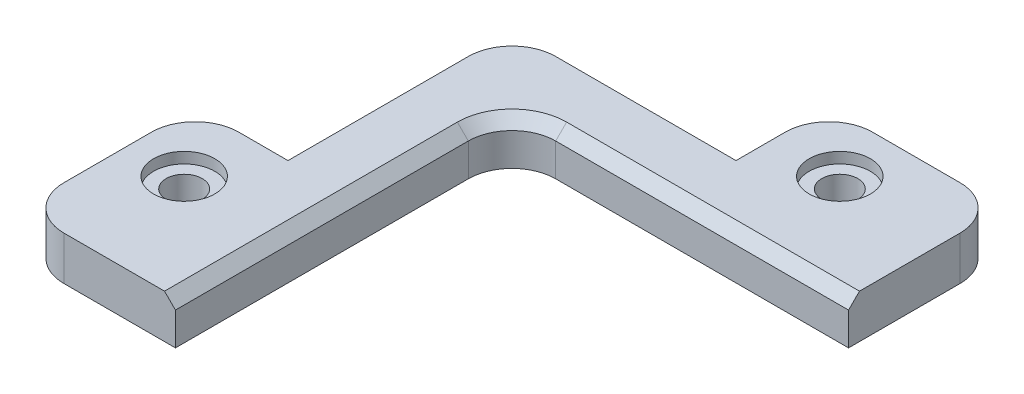
ISO-10303-21;
HEADER;
FILE_DESCRIPTION(('STEP AP214'),'2;1');
FILE_NAME('part.step','',(''),(''),'','','');
FILE_SCHEMA(('AUTOMOTIVE_DESIGN { 1 0 10303 214 1 1 1 1 }'));
ENDSEC;
DATA;
#1=APPLICATION_CONTEXT('core data for automotive mechanical design processes');
#2=APPLICATION_PROTOCOL_DEFINITION('international standard','automotive_design',2000,#1);
#3=PRODUCT_CONTEXT('',#1,'mechanical');
#4=PRODUCT('Part','Part','',(#3));
#5=PRODUCT_RELATED_PRODUCT_CATEGORY('part','',(#4));
#6=PRODUCT_DEFINITION_FORMATION('','',#4);
#7=PRODUCT_DEFINITION_CONTEXT('part definition',#1,'design');
#8=PRODUCT_DEFINITION('design','',#6,#7);
#9=PRODUCT_DEFINITION_SHAPE('','',#8);
#10=(LENGTH_UNIT() NAMED_UNIT(*) SI_UNIT(.MILLI.,.METRE.));
#11=(NAMED_UNIT(*) PLANE_ANGLE_UNIT() SI_UNIT($,.RADIAN.));
#12=(NAMED_UNIT(*) SI_UNIT($,.STERADIAN.) SOLID_ANGLE_UNIT());
#13=UNCERTAINTY_MEASURE_WITH_UNIT(LENGTH_MEASURE(1.E-05),#10,'distance_accuracy_value','');
#14=(GEOMETRIC_REPRESENTATION_CONTEXT(3) GLOBAL_UNCERTAINTY_ASSIGNED_CONTEXT((#13)) GLOBAL_UNIT_ASSIGNED_CONTEXT((#10,
#11,#12)) REPRESENTATION_CONTEXT('',''));
#15=CARTESIAN_POINT('',(0.,0.,0.));
#16=DIRECTION('',(0.,0.,1.));
#17=DIRECTION('',(1.,0.,0.));
#18=AXIS2_PLACEMENT_3D('',#15,#16,#17);
#19=CARTESIAN_POINT('',(35.,4.,-40.));
#20=DIRECTION('',(0.,-1.,0.));
#21=DIRECTION('',(0.,0.,-1.));
#22=AXIS2_PLACEMENT_3D('',#19,#20,#21);
#23=CYLINDRICAL_SURFACE('',#22,1.65);
#24=CARTESIAN_POINT('',(35.,0.,-40.));
#25=DIRECTION('',(0.,1.,0.));
#26=DIRECTION('',(0.,0.,1.));
#27=AXIS2_PLACEMENT_3D('',#24,#25,#26);
#28=CIRCLE('',#27,1.65);
#29=CARTESIAN_POINT('',(35.,0.,-38.35));
#30=VERTEX_POINT('',#29);
#31=EDGE_CURVE('E211',#30,#30,#28,.T.);
#32=ORIENTED_EDGE('',*,*,#31,.F.);
#33=EDGE_LOOP('',(#32));
#34=FACE_BOUND('',#33,.T.);
#35=CARTESIAN_POINT('',(35.,3.,-40.));
#36=DIRECTION('',(0.,1.,0.));
#37=DIRECTION('',(0.,0.,1.));
#38=AXIS2_PLACEMENT_3D('',#35,#36,#37);
#39=CIRCLE('',#38,1.65);
#40=CARTESIAN_POINT('',(35.,3.,-38.35));
#41=VERTEX_POINT('',#40);
#42=EDGE_CURVE('E39',#41,#41,#39,.T.);
#43=ORIENTED_EDGE('',*,*,#42,.T.);
#44=EDGE_LOOP('',(#43));
#45=FACE_BOUND('',#44,.T.);
#46=ADVANCED_FACE('F35',(#34,#45),#23,.F.);
#47=CARTESIAN_POINT('',(5.,4.,-9.99999999999999));
#48=DIRECTION('',(0.,-1.,0.));
#49=DIRECTION('',(0.,0.,-1.));
#50=AXIS2_PLACEMENT_3D('',#47,#48,#49);
#51=CYLINDRICAL_SURFACE('',#50,1.65);
#52=CARTESIAN_POINT('',(5.,0.,-9.99999999999999));
#53=DIRECTION('',(0.,1.,0.));
#54=DIRECTION('',(0.,0.,1.));
#55=AXIS2_PLACEMENT_3D('',#52,#53,#54);
#56=CIRCLE('',#55,1.65);
#57=CARTESIAN_POINT('',(5.,0.,-8.34999999999999));
#58=VERTEX_POINT('',#57);
#59=EDGE_CURVE('E205',#58,#58,#56,.T.);
#60=ORIENTED_EDGE('',*,*,#59,.F.);
#61=EDGE_LOOP('',(#60));
#62=FACE_BOUND('',#61,.T.);
#63=CARTESIAN_POINT('',(5.,3.,-9.99999999999999));
#64=DIRECTION('',(0.,1.,0.));
#65=DIRECTION('',(0.,0.,1.));
#66=AXIS2_PLACEMENT_3D('',#63,#64,#65);
#67=CIRCLE('',#66,1.65);
#68=CARTESIAN_POINT('',(5.,3.,-8.34999999999999));
#69=VERTEX_POINT('',#68);
#70=EDGE_CURVE('E302',#69,#69,#67,.T.);
#71=ORIENTED_EDGE('',*,*,#70,.T.);
#72=EDGE_LOOP('',(#71));
#73=FACE_BOUND('',#72,.T.);
#74=ADVANCED_FACE('F406',(#62,#73),#51,.F.);
#75=CARTESIAN_POINT('',(0.,4.,-45.));
#76=DIRECTION('',(0.,0.,1.));
#77=DIRECTION('',(1.,0.,0.));
#78=AXIS2_PLACEMENT_3D('',#75,#76,#77);
#79=PLANE('',#78);
#80=DIRECTION('',(-1.,0.,0.));
#81=VECTOR('',#80,1.);
#82=CARTESIAN_POINT('',(0.,0.,-45.));
#83=LINE('',#82,#81);
#84=CARTESIAN_POINT('',(41.,0.,-45.));
#85=VERTEX_POINT('',#84);
#86=CARTESIAN_POINT('',(33.,0.,-45.));
#87=VERTEX_POINT('',#86);
#88=EDGE_CURVE('E230',#85,#87,#83,.T.);
#89=ORIENTED_EDGE('',*,*,#88,.T.);
#90=DIRECTION('',(0.,1.,0.));
#91=VECTOR('',#90,1.);
#92=CARTESIAN_POINT('',(33.,4.,-45.));
#93=LINE('',#92,#91);
#94=CARTESIAN_POINT('',(33.,4.,-45.));
#95=VERTEX_POINT('',#94);
#96=EDGE_CURVE('E276',#87,#95,#93,.T.);
#97=ORIENTED_EDGE('',*,*,#96,.T.);
#98=DIRECTION('',(-1.,0.,0.));
#99=VECTOR('',#98,1.);
#100=CARTESIAN_POINT('',(0.,4.,-45.));
#101=LINE('',#100,#99);
#102=CARTESIAN_POINT('',(41.,4.,-45.));
#103=VERTEX_POINT('',#102);
#104=EDGE_CURVE('E220',#103,#95,#101,.T.);
#105=ORIENTED_EDGE('',*,*,#104,.F.);
#106=DIRECTION('',(0.,-1.,0.));
#107=VECTOR('',#106,1.);
#108=CARTESIAN_POINT('',(41.,4.,-45.));
#109=LINE('',#108,#107);
#110=EDGE_CURVE('E273',#103,#85,#109,.T.);
#111=ORIENTED_EDGE('',*,*,#110,.T.);
#112=EDGE_LOOP('',(#89,#97,#105,#111));
#113=FACE_BOUND('',#112,.T.);
#114=ADVANCED_FACE('F352',(#113),#79,.F.);
#115=CARTESIAN_POINT('',(0.,4.,0.));
#116=DIRECTION('',(0.,-1.,0.));
#117=DIRECTION('',(0.,0.,-1.));
#118=AXIS2_PLACEMENT_3D('',#115,#116,#117);
#119=PLANE('',#118);
#120=CARTESIAN_POINT('',(35.,4.,-40.));
#121=DIRECTION('',(0.,1.,0.));
#122=DIRECTION('',(0.,0.,1.));
#123=AXIS2_PLACEMENT_3D('',#120,#121,#122);
#124=CIRCLE('',#123,2.8);
#125=CARTESIAN_POINT('',(35.,4.,-37.2));
#126=VERTEX_POINT('',#125);
#127=EDGE_CURVE('E309',#126,#126,#124,.T.);
#128=ORIENTED_EDGE('',*,*,#127,.F.);
#129=EDGE_LOOP('',(#128));
#130=FACE_BOUND('',#129,.T.);
#131=CARTESIAN_POINT('',(5.,4.,-9.99999999999999));
#132=DIRECTION('',(0.,1.,0.));
#133=DIRECTION('',(0.,0.,1.));
#134=AXIS2_PLACEMENT_3D('',#131,#132,#133);
#135=CIRCLE('',#134,2.8);
#136=CARTESIAN_POINT('',(5.,4.,-7.19999999999999));
#137=VERTEX_POINT('',#136);
#138=EDGE_CURVE('E319',#137,#137,#135,.T.);
#139=ORIENTED_EDGE('',*,*,#138,.F.);
#140=EDGE_LOOP('',(#139));
#141=FACE_BOUND('',#140,.T.);
#142=DIRECTION('',(1.,0.,0.));
#143=VECTOR('',#142,1.);
#144=CARTESIAN_POINT('',(10.,4.,0.));
#145=LINE('',#144,#143);
#146=CARTESIAN_POINT('',(4.,4.,0.));
#147=VERTEX_POINT('',#146);
#148=CARTESIAN_POINT('',(13.2,4.,0.));
#149=VERTEX_POINT('',#148);
#150=EDGE_CURVE('E215',#147,#149,#145,.T.);
#151=ORIENTED_EDGE('',*,*,#150,.T.);
#152=DIRECTION('',(0.,0.,-1.));
#153=VECTOR('',#152,1.);
#154=CARTESIAN_POINT('',(13.2,4.,-26.8));
#155=LINE('',#154,#153);
#156=CARTESIAN_POINT('',(13.2,4.,-26.8));
#157=VERTEX_POINT('',#156);
#158=EDGE_CURVE('E288',#149,#157,#155,.T.);
#159=ORIENTED_EDGE('',*,*,#158,.T.);
#160=CARTESIAN_POINT('',(18.2,4.,-26.8));
#161=DIRECTION('',(0.,-1.,0.));
#162=DIRECTION('',(0.,0.,-1.));
#163=AXIS2_PLACEMENT_3D('',#160,#161,#162);
#164=CIRCLE('',#163,4.99999999999998);
#165=CARTESIAN_POINT('',(18.2,4.,-31.8));
#166=VERTEX_POINT('',#165);
#167=EDGE_CURVE('E286',#157,#166,#164,.T.);
#168=ORIENTED_EDGE('',*,*,#167,.T.);
#169=DIRECTION('',(1.,0.,0.));
#170=VECTOR('',#169,1.);
#171=CARTESIAN_POINT('',(0.,4.,-31.8));
#172=LINE('',#171,#170);
#173=CARTESIAN_POINT('',(45.,4.,-31.8));
#174=VERTEX_POINT('',#173);
#175=EDGE_CURVE('E284',#166,#174,#172,.T.);
#176=ORIENTED_EDGE('',*,*,#175,.T.);
#177=DIRECTION('',(0.,0.,-1.));
#178=VECTOR('',#177,1.);
#179=CARTESIAN_POINT('',(45.,4.,-45.));
#180=LINE('',#179,#178);
#181=CARTESIAN_POINT('',(45.,4.,-41.));
#182=VERTEX_POINT('',#181);
#183=EDGE_CURVE('E217',#174,#182,#180,.T.);
#184=ORIENTED_EDGE('',*,*,#183,.T.);
#185=CARTESIAN_POINT('',(41.,4.,-41.));
#186=DIRECTION('',(0.,-1.,0.));
#187=DIRECTION('',(0.,0.,-1.));
#188=AXIS2_PLACEMENT_3D('',#185,#186,#187);
#189=CIRCLE('',#188,4.);
#190=EDGE_CURVE('E263',#182,#103,#189,.F.);
#191=ORIENTED_EDGE('',*,*,#190,.T.);
#192=ORIENTED_EDGE('',*,*,#104,.T.);
#193=CARTESIAN_POINT('',(33.,4.,-41.));
#194=DIRECTION('',(0.,-1.,0.));
#195=DIRECTION('',(0.,0.,-1.));
#196=AXIS2_PLACEMENT_3D('',#193,#194,#195);
#197=CIRCLE('',#196,4.);
#198=CARTESIAN_POINT('',(29.,4.,-41.));
#199=VERTEX_POINT('',#198);
#200=EDGE_CURVE('E167',#95,#199,#197,.F.);
#201=ORIENTED_EDGE('',*,*,#200,.T.);
#202=DIRECTION('',(0.,0.,1.));
#203=VECTOR('',#202,1.);
#204=CARTESIAN_POINT('',(29.,4.,0.));
#205=LINE('',#204,#203);
#206=CARTESIAN_POINT('',(29.,4.,-36.5));
#207=VERTEX_POINT('',#206);
#208=EDGE_CURVE('E161',#199,#207,#205,.T.);
#209=ORIENTED_EDGE('',*,*,#208,.T.);
#210=DIRECTION('',(1.,0.,0.));
#211=VECTOR('',#210,1.);
#212=CARTESIAN_POINT('',(0.,4.,-36.5));
#213=LINE('',#212,#211);
#214=CARTESIAN_POINT('',(12.5,4.,-36.5));
#215=VERTEX_POINT('',#214);
#216=EDGE_CURVE('E165',#215,#207,#213,.T.);
#217=ORIENTED_EDGE('',*,*,#216,.F.);
#218=CARTESIAN_POINT('',(12.5,4.,-32.5));
#219=DIRECTION('',(0.,-1.,0.));
#220=DIRECTION('',(0.,0.,-1.));
#221=AXIS2_PLACEMENT_3D('',#218,#219,#220);
#222=CIRCLE('',#221,4.);
#223=CARTESIAN_POINT('',(8.5,4.,-32.5));
#224=VERTEX_POINT('',#223);
#225=EDGE_CURVE('E240',#215,#224,#222,.F.);
#226=ORIENTED_EDGE('',*,*,#225,.T.);
#227=DIRECTION('',(0.,0.,1.));
#228=VECTOR('',#227,1.);
#229=CARTESIAN_POINT('',(8.50000000000001,4.,0.));
#230=LINE('',#229,#228);
#231=CARTESIAN_POINT('',(8.5,4.,-16.));
#232=VERTEX_POINT('',#231);
#233=EDGE_CURVE('E190',#224,#232,#230,.T.);
#234=ORIENTED_EDGE('',*,*,#233,.T.);
#235=DIRECTION('',(1.,0.,0.));
#236=VECTOR('',#235,1.);
#237=CARTESIAN_POINT('',(0.,4.,-16.));
#238=LINE('',#237,#236);
#239=CARTESIAN_POINT('',(4.,4.,-16.));
#240=VERTEX_POINT('',#239);
#241=EDGE_CURVE('E182',#240,#232,#238,.T.);
#242=ORIENTED_EDGE('',*,*,#241,.F.);
#243=CARTESIAN_POINT('',(4.,4.,-12.));
#244=DIRECTION('',(0.,-1.,0.));
#245=DIRECTION('',(0.,0.,-1.));
#246=AXIS2_PLACEMENT_3D('',#243,#244,#245);
#247=CIRCLE('',#246,4.);
#248=CARTESIAN_POINT('',(0.,4.,-12.));
#249=VERTEX_POINT('',#248);
#250=EDGE_CURVE('E266',#240,#249,#247,.F.);
#251=ORIENTED_EDGE('',*,*,#250,.T.);
#252=DIRECTION('',(0.,0.,1.));
#253=VECTOR('',#252,1.);
#254=CARTESIAN_POINT('',(0.,4.,0.));
#255=LINE('',#254,#253);
#256=CARTESIAN_POINT('',(0.,4.,-4.));
#257=VERTEX_POINT('',#256);
#258=EDGE_CURVE('E222',#249,#257,#255,.T.);
#259=ORIENTED_EDGE('',*,*,#258,.T.);
#260=CARTESIAN_POINT('',(4.,4.,-4.));
#261=DIRECTION('',(0.,-1.,0.));
#262=DIRECTION('',(0.,0.,-1.));
#263=AXIS2_PLACEMENT_3D('',#260,#261,#262);
#264=CIRCLE('',#263,4.);
#265=EDGE_CURVE('E268',#257,#147,#264,.F.);
#266=ORIENTED_EDGE('',*,*,#265,.T.);
#267=EDGE_LOOP('',(#151,#159,#168,#176,#184,#191,#192,#201,#209,#217,#226,#234,#242,#251,#259,#266));
#268=FACE_BOUND('',#267,.T.);
#269=ADVANCED_FACE('F164',(#130,#141,#268),#119,.F.);
#270=CARTESIAN_POINT('',(0.,0.,0.));
#271=DIRECTION('',(0.,-1.,0.));
#272=DIRECTION('',(0.,0.,-1.));
#273=AXIS2_PLACEMENT_3D('',#270,#271,#272);
#274=PLANE('',#273);
#275=DIRECTION('',(1.,0.,0.));
#276=VECTOR('',#275,1.);
#277=CARTESIAN_POINT('',(10.,0.,0.));
#278=LINE('',#277,#276);
#279=CARTESIAN_POINT('',(4.,0.,0.));
#280=VERTEX_POINT('',#279);
#281=CARTESIAN_POINT('',(14.2,0.,0.));
#282=VERTEX_POINT('',#281);
#283=EDGE_CURVE('E214',#280,#282,#278,.T.);
#284=ORIENTED_EDGE('',*,*,#283,.F.);
#285=CARTESIAN_POINT('',(4.,0.,-4.));
#286=DIRECTION('',(0.,-1.,0.));
#287=DIRECTION('',(0.,0.,-1.));
#288=AXIS2_PLACEMENT_3D('',#285,#286,#287);
#289=CIRCLE('',#288,4.);
#290=CARTESIAN_POINT('',(0.,0.,-4.));
#291=VERTEX_POINT('',#290);
#292=EDGE_CURVE('E257',#280,#291,#289,.T.);
#293=ORIENTED_EDGE('',*,*,#292,.T.);
#294=DIRECTION('',(0.,0.,1.));
#295=VECTOR('',#294,1.);
#296=CARTESIAN_POINT('',(0.,0.,0.));
#297=LINE('',#296,#295);
#298=CARTESIAN_POINT('',(0.,0.,-12.));
#299=VERTEX_POINT('',#298);
#300=EDGE_CURVE('E218',#299,#291,#297,.T.);
#301=ORIENTED_EDGE('',*,*,#300,.F.);
#302=CARTESIAN_POINT('',(4.,0.,-12.));
#303=DIRECTION('',(0.,-1.,0.));
#304=DIRECTION('',(0.,0.,-1.));
#305=AXIS2_PLACEMENT_3D('',#302,#303,#304);
#306=CIRCLE('',#305,4.);
#307=CARTESIAN_POINT('',(4.,0.,-16.));
#308=VERTEX_POINT('',#307);
#309=EDGE_CURVE('E255',#299,#308,#306,.T.);
#310=ORIENTED_EDGE('',*,*,#309,.T.);
#311=DIRECTION('',(1.,0.,0.));
#312=VECTOR('',#311,1.);
#313=CARTESIAN_POINT('',(0.,0.,-16.));
#314=LINE('',#313,#312);
#315=CARTESIAN_POINT('',(8.5,0.,-16.));
#316=VERTEX_POINT('',#315);
#317=EDGE_CURVE('E181',#308,#316,#314,.T.);
#318=ORIENTED_EDGE('',*,*,#317,.T.);
#319=DIRECTION('',(0.,0.,1.));
#320=VECTOR('',#319,1.);
#321=CARTESIAN_POINT('',(8.50000000000001,0.,0.));
#322=LINE('',#321,#320);
#323=CARTESIAN_POINT('',(8.5,0.,-32.5));
#324=VERTEX_POINT('',#323);
#325=EDGE_CURVE('E324',#324,#316,#322,.T.);
#326=ORIENTED_EDGE('',*,*,#325,.F.);
#327=CARTESIAN_POINT('',(12.5,0.,-32.5));
#328=DIRECTION('',(0.,-1.,0.));
#329=DIRECTION('',(0.,0.,-1.));
#330=AXIS2_PLACEMENT_3D('',#327,#328,#329);
#331=CIRCLE('',#330,4.);
#332=CARTESIAN_POINT('',(12.5,0.,-36.5));
#333=VERTEX_POINT('',#332);
#334=EDGE_CURVE('E244',#324,#333,#331,.T.);
#335=ORIENTED_EDGE('',*,*,#334,.T.);
#336=DIRECTION('',(1.,0.,0.));
#337=VECTOR('',#336,1.);
#338=CARTESIAN_POINT('',(0.,0.,-36.5));
#339=LINE('',#338,#337);
#340=CARTESIAN_POINT('',(29.,0.,-36.5));
#341=VERTEX_POINT('',#340);
#342=EDGE_CURVE('E188',#333,#341,#339,.T.);
#343=ORIENTED_EDGE('',*,*,#342,.T.);
#344=DIRECTION('',(0.,0.,1.));
#345=VECTOR('',#344,1.);
#346=CARTESIAN_POINT('',(29.,0.,0.));
#347=LINE('',#346,#345);
#348=CARTESIAN_POINT('',(29.,0.,-41.));
#349=VERTEX_POINT('',#348);
#350=EDGE_CURVE('E186',#349,#341,#347,.T.);
#351=ORIENTED_EDGE('',*,*,#350,.F.);
#352=CARTESIAN_POINT('',(33.,0.,-41.));
#353=DIRECTION('',(0.,-1.,0.));
#354=DIRECTION('',(0.,0.,-1.));
#355=AXIS2_PLACEMENT_3D('',#352,#353,#354);
#356=CIRCLE('',#355,4.);
#357=EDGE_CURVE('E253',#349,#87,#356,.T.);
#358=ORIENTED_EDGE('',*,*,#357,.T.);
#359=ORIENTED_EDGE('',*,*,#88,.F.);
#360=CARTESIAN_POINT('',(41.,0.,-41.));
#361=DIRECTION('',(0.,-1.,0.));
#362=DIRECTION('',(0.,0.,-1.));
#363=AXIS2_PLACEMENT_3D('',#360,#361,#362);
#364=CIRCLE('',#363,4.);
#365=CARTESIAN_POINT('',(45.,0.,-41.));
#366=VERTEX_POINT('',#365);
#367=EDGE_CURVE('E251',#85,#366,#364,.T.);
#368=ORIENTED_EDGE('',*,*,#367,.T.);
#369=DIRECTION('',(0.,0.,-1.));
#370=VECTOR('',#369,1.);
#371=CARTESIAN_POINT('',(45.,0.,-45.));
#372=LINE('',#371,#370);
#373=CARTESIAN_POINT('',(45.,0.,-30.8));
#374=VERTEX_POINT('',#373);
#375=EDGE_CURVE('E227',#374,#366,#372,.T.);
#376=ORIENTED_EDGE('',*,*,#375,.F.);
#377=DIRECTION('',(-1.,0.,0.));
#378=VECTOR('',#377,1.);
#379=CARTESIAN_POINT('',(0.,0.,-30.8));
#380=LINE('',#379,#378);
#381=CARTESIAN_POINT('',(18.2,0.,-30.8));
#382=VERTEX_POINT('',#381);
#383=EDGE_CURVE('E202',#374,#382,#380,.T.);
#384=ORIENTED_EDGE('',*,*,#383,.T.);
#385=CARTESIAN_POINT('',(18.2,0.,-26.8));
#386=DIRECTION('',(0.,-1.,0.));
#387=DIRECTION('',(0.,0.,-1.));
#388=AXIS2_PLACEMENT_3D('',#385,#386,#387);
#389=CIRCLE('',#388,4.);
#390=CARTESIAN_POINT('',(14.2,0.,-26.8));
#391=VERTEX_POINT('',#390);
#392=EDGE_CURVE('E246',#382,#391,#389,.F.);
#393=ORIENTED_EDGE('',*,*,#392,.T.);
#394=DIRECTION('',(0.,0.,-1.));
#395=VECTOR('',#394,1.);
#396=CARTESIAN_POINT('',(14.2,0.,0.));
#397=LINE('',#396,#395);
#398=EDGE_CURVE('E198',#282,#391,#397,.T.);
#399=ORIENTED_EDGE('',*,*,#398,.F.);
#400=EDGE_LOOP('',(#284,#293,#301,#310,#318,#326,#335,#343,#351,#358,#359,#368,#376,#384,#393,#399));
#401=FACE_BOUND('',#400,.T.);
#402=ORIENTED_EDGE('',*,*,#31,.T.);
#403=EDGE_LOOP('',(#402));
#404=FACE_BOUND('',#403,.T.);
#405=ORIENTED_EDGE('',*,*,#59,.T.);
#406=EDGE_LOOP('',(#405));
#407=FACE_BOUND('',#406,.T.);
#408=ADVANCED_FACE('F343',(#401,#404,#407),#274,.T.);
#409=CARTESIAN_POINT('',(10.,4.,0.));
#410=DIRECTION('',(0.,0.,-1.));
#411=DIRECTION('',(-1.,0.,0.));
#412=AXIS2_PLACEMENT_3D('',#409,#410,#411);
#413=PLANE('',#412);
#414=DIRECTION('',(0.,1.,0.));
#415=VECTOR('',#414,1.);
#416=CARTESIAN_POINT('',(14.2,-49.4974746830583,0.));
#417=LINE('',#416,#415);
#418=CARTESIAN_POINT('',(14.2,3.00000000000002,0.));
#419=VERTEX_POINT('',#418);
#420=EDGE_CURVE('E201',#282,#419,#417,.T.);
#421=ORIENTED_EDGE('',*,*,#420,.T.);
#422=DIRECTION('',(-0.707106781186549,0.707106781186546,0.));
#423=VECTOR('',#422,1.);
#424=CARTESIAN_POINT('',(13.2,4.,0.));
#425=LINE('',#424,#423);
#426=EDGE_CURVE('E293',#419,#149,#425,.T.);
#427=ORIENTED_EDGE('',*,*,#426,.T.);
#428=ORIENTED_EDGE('',*,*,#150,.F.);
#429=DIRECTION('',(0.,-1.,0.));
#430=VECTOR('',#429,1.);
#431=CARTESIAN_POINT('',(4.,4.,0.));
#432=LINE('',#431,#430);
#433=EDGE_CURVE('E248',#147,#280,#432,.T.);
#434=ORIENTED_EDGE('',*,*,#433,.T.);
#435=ORIENTED_EDGE('',*,*,#283,.T.);
#436=EDGE_LOOP('',(#421,#427,#428,#434,#435));
#437=FACE_BOUND('',#436,.T.);
#438=ADVANCED_FACE('F385',(#437),#413,.F.);
#439=CARTESIAN_POINT('',(45.,4.,-45.));
#440=DIRECTION('',(-1.,0.,0.));
#441=DIRECTION('',(0.,0.,1.));
#442=AXIS2_PLACEMENT_3D('',#439,#440,#441);
#443=PLANE('',#442);
#444=ORIENTED_EDGE('',*,*,#183,.F.);
#445=DIRECTION('',(0.,0.707106781186545,-0.70710678118655));
#446=VECTOR('',#445,1.);
#447=CARTESIAN_POINT('',(45.,3.00000000000001,-30.8));
#448=LINE('',#447,#446);
#449=CARTESIAN_POINT('',(45.,3.00000000000002,-30.8));
#450=VERTEX_POINT('',#449);
#451=EDGE_CURVE('E11',#174,#450,#448,.F.);
#452=ORIENTED_EDGE('',*,*,#451,.T.);
#453=DIRECTION('',(0.,1.,0.));
#454=VECTOR('',#453,1.);
#455=CARTESIAN_POINT('',(45.,-49.4974746830583,-30.8));
#456=LINE('',#455,#454);
#457=EDGE_CURVE('E171',#374,#450,#456,.T.);
#458=ORIENTED_EDGE('',*,*,#457,.F.);
#459=ORIENTED_EDGE('',*,*,#375,.T.);
#460=DIRECTION('',(0.,-1.,0.));
#461=VECTOR('',#460,1.);
#462=CARTESIAN_POINT('',(45.,4.,-41.));
#463=LINE('',#462,#461);
#464=EDGE_CURVE('E281',#366,#182,#463,.F.);
#465=ORIENTED_EDGE('',*,*,#464,.T.);
#466=EDGE_LOOP('',(#444,#452,#458,#459,#465));
#467=FACE_BOUND('',#466,.T.);
#468=ADVANCED_FACE('F358',(#467),#443,.F.);
#469=CARTESIAN_POINT('',(0.,4.,0.));
#470=DIRECTION('',(1.,0.,0.));
#471=DIRECTION('',(0.,0.,-1.));
#472=AXIS2_PLACEMENT_3D('',#469,#470,#471);
#473=PLANE('',#472);
#474=ORIENTED_EDGE('',*,*,#300,.T.);
#475=DIRECTION('',(0.,-1.,0.));
#476=VECTOR('',#475,1.);
#477=CARTESIAN_POINT('',(0.,4.,-4.));
#478=LINE('',#477,#476);
#479=EDGE_CURVE('E261',#291,#257,#478,.F.);
#480=ORIENTED_EDGE('',*,*,#479,.T.);
#481=ORIENTED_EDGE('',*,*,#258,.F.);
#482=DIRECTION('',(0.,1.,0.));
#483=VECTOR('',#482,1.);
#484=CARTESIAN_POINT('',(0.,4.,-12.));
#485=LINE('',#484,#483);
#486=EDGE_CURVE('E259',#249,#299,#485,.F.);
#487=ORIENTED_EDGE('',*,*,#486,.T.);
#488=EDGE_LOOP('',(#474,#480,#481,#487));
#489=FACE_BOUND('',#488,.T.);
#490=ADVANCED_FACE('F392',(#489),#473,.F.);
#491=CARTESIAN_POINT('',(0.,-49.4974746830583,-30.8));
#492=DIRECTION('',(0.,0.,-1.));
#493=DIRECTION('',(-1.,0.,0.));
#494=AXIS2_PLACEMENT_3D('',#491,#492,#493);
#495=PLANE('',#494);
#496=ORIENTED_EDGE('',*,*,#457,.T.);
#497=DIRECTION('',(-1.,0.,0.));
#498=VECTOR('',#497,1.);
#499=CARTESIAN_POINT('',(0.,3.00000000000002,-30.8));
#500=LINE('',#499,#498);
#501=CARTESIAN_POINT('',(18.2,3.00000000000002,-30.8));
#502=VERTEX_POINT('',#501);
#503=EDGE_CURVE('E44',#450,#502,#500,.T.);
#504=ORIENTED_EDGE('',*,*,#503,.T.);
#505=DIRECTION('',(0.,1.,0.));
#506=VECTOR('',#505,1.);
#507=CARTESIAN_POINT('',(18.2,-49.4974746830583,-30.8));
#508=LINE('',#507,#506);
#509=EDGE_CURVE('E237',#502,#382,#508,.F.);
#510=ORIENTED_EDGE('',*,*,#509,.T.);
#511=ORIENTED_EDGE('',*,*,#383,.F.);
#512=EDGE_LOOP('',(#496,#504,#510,#511));
#513=FACE_BOUND('',#512,.T.);
#514=ADVANCED_FACE('F360',(#513),#495,.F.);
#515=CARTESIAN_POINT('',(14.2,-49.4974746830583,0.));
#516=DIRECTION('',(1.,0.,0.));
#517=DIRECTION('',(0.,0.,-1.));
#518=AXIS2_PLACEMENT_3D('',#515,#516,#517);
#519=PLANE('',#518);
#520=DIRECTION('',(0.,1.,0.));
#521=VECTOR('',#520,1.);
#522=CARTESIAN_POINT('',(14.2,-49.4974746830583,-26.8));
#523=LINE('',#522,#521);
#524=CARTESIAN_POINT('',(14.2,3.00000000000002,-26.8));
#525=VERTEX_POINT('',#524);
#526=EDGE_CURVE('E225',#391,#525,#523,.T.);
#527=ORIENTED_EDGE('',*,*,#526,.T.);
#528=DIRECTION('',(0.,0.,1.));
#529=VECTOR('',#528,1.);
#530=CARTESIAN_POINT('',(14.2,3.00000000000002,0.));
#531=LINE('',#530,#529);
#532=EDGE_CURVE('E291',#525,#419,#531,.T.);
#533=ORIENTED_EDGE('',*,*,#532,.T.);
#534=ORIENTED_EDGE('',*,*,#420,.F.);
#535=ORIENTED_EDGE('',*,*,#398,.T.);
#536=EDGE_LOOP('',(#527,#533,#534,#535));
#537=FACE_BOUND('',#536,.T.);
#538=ADVANCED_FACE('F370',(#537),#519,.T.);
#539=CARTESIAN_POINT('',(0.,-41.0121933088198,-16.));
#540=DIRECTION('',(0.,0.,1.));
#541=DIRECTION('',(1.,0.,0.));
#542=AXIS2_PLACEMENT_3D('',#539,#540,#541);
#543=PLANE('',#542);
#544=ORIENTED_EDGE('',*,*,#317,.F.);
#545=DIRECTION('',(0.,1.,0.));
#546=VECTOR('',#545,1.);
#547=CARTESIAN_POINT('',(4.,-41.0121933088198,-16.));
#548=LINE('',#547,#546);
#549=EDGE_CURVE('E270',#308,#240,#548,.T.);
#550=ORIENTED_EDGE('',*,*,#549,.T.);
#551=ORIENTED_EDGE('',*,*,#241,.T.);
#552=DIRECTION('',(0.,1.,0.));
#553=VECTOR('',#552,1.);
#554=CARTESIAN_POINT('',(8.5,-41.0121933088198,-16.));
#555=LINE('',#554,#553);
#556=EDGE_CURVE('E195',#316,#232,#555,.T.);
#557=ORIENTED_EDGE('',*,*,#556,.F.);
#558=EDGE_LOOP('',(#544,#550,#551,#557));
#559=FACE_BOUND('',#558,.T.);
#560=ADVANCED_FACE('F337',(#559),#543,.F.);
#561=CARTESIAN_POINT('',(8.50000000000001,-41.0121933088198,0.));
#562=DIRECTION('',(-1.,0.,0.));
#563=DIRECTION('',(0.,0.,1.));
#564=AXIS2_PLACEMENT_3D('',#561,#562,#563);
#565=PLANE('',#564);
#566=ORIENTED_EDGE('',*,*,#233,.F.);
#567=DIRECTION('',(0.,1.,0.));
#568=VECTOR('',#567,1.);
#569=CARTESIAN_POINT('',(8.5,0.,-32.5));
#570=LINE('',#569,#568);
#571=EDGE_CURVE('E242',#224,#324,#570,.F.);
#572=ORIENTED_EDGE('',*,*,#571,.T.);
#573=ORIENTED_EDGE('',*,*,#325,.T.);
#574=ORIENTED_EDGE('',*,*,#556,.T.);
#575=EDGE_LOOP('',(#566,#572,#573,#574));
#576=FACE_BOUND('',#575,.T.);
#577=ADVANCED_FACE('F331',(#576),#565,.T.);
#578=CARTESIAN_POINT('',(0.,-41.0121933088198,-36.5));
#579=DIRECTION('',(0.,0.,1.));
#580=DIRECTION('',(1.,0.,0.));
#581=AXIS2_PLACEMENT_3D('',#578,#579,#580);
#582=PLANE('',#581);
#583=ORIENTED_EDGE('',*,*,#342,.F.);
#584=DIRECTION('',(0.,1.,0.));
#585=VECTOR('',#584,1.);
#586=CARTESIAN_POINT('',(12.5,4.,-36.5));
#587=LINE('',#586,#585);
#588=EDGE_CURVE('E180',#333,#215,#587,.T.);
#589=ORIENTED_EDGE('',*,*,#588,.T.);
#590=ORIENTED_EDGE('',*,*,#216,.T.);
#591=DIRECTION('',(0.,1.,0.));
#592=VECTOR('',#591,1.);
#593=CARTESIAN_POINT('',(29.,-41.0121933088198,-36.5));
#594=LINE('',#593,#592);
#595=EDGE_CURVE('E172',#341,#207,#594,.T.);
#596=ORIENTED_EDGE('',*,*,#595,.F.);
#597=EDGE_LOOP('',(#583,#589,#590,#596));
#598=FACE_BOUND('',#597,.T.);
#599=ADVANCED_FACE('F178',(#598),#582,.F.);
#600=CARTESIAN_POINT('',(29.,-41.0121933088198,0.));
#601=DIRECTION('',(-1.,0.,0.));
#602=DIRECTION('',(0.,0.,1.));
#603=AXIS2_PLACEMENT_3D('',#600,#601,#602);
#604=PLANE('',#603);
#605=ORIENTED_EDGE('',*,*,#208,.F.);
#606=DIRECTION('',(0.,1.,0.));
#607=VECTOR('',#606,1.);
#608=CARTESIAN_POINT('',(29.,0.,-41.));
#609=LINE('',#608,#607);
#610=EDGE_CURVE('E279',#199,#349,#609,.F.);
#611=ORIENTED_EDGE('',*,*,#610,.T.);
#612=ORIENTED_EDGE('',*,*,#350,.T.);
#613=ORIENTED_EDGE('',*,*,#595,.T.);
#614=EDGE_LOOP('',(#605,#611,#612,#613));
#615=FACE_BOUND('',#614,.T.);
#616=ADVANCED_FACE('F184',(#615),#604,.T.);
#617=CARTESIAN_POINT('',(18.2,-49.4974746830583,-26.8));
#618=DIRECTION('',(0.,1.,0.));
#619=DIRECTION('',(0.,0.,1.));
#620=AXIS2_PLACEMENT_3D('',#617,#618,#619);
#621=CYLINDRICAL_SURFACE('',#620,4.);
#622=ORIENTED_EDGE('',*,*,#509,.F.);
#623=CARTESIAN_POINT('',(18.2,3.00000000000002,-26.8));
#624=DIRECTION('',(0.,-1.,0.));
#625=DIRECTION('',(0.,0.,-1.));
#626=AXIS2_PLACEMENT_3D('',#623,#624,#625);
#627=CIRCLE('',#626,4.);
#628=EDGE_CURVE('E295',#502,#525,#627,.F.);
#629=ORIENTED_EDGE('',*,*,#628,.T.);
#630=ORIENTED_EDGE('',*,*,#526,.F.);
#631=ORIENTED_EDGE('',*,*,#392,.F.);
#632=EDGE_LOOP('',(#622,#629,#630,#631));
#633=FACE_BOUND('',#632,.T.);
#634=ADVANCED_FACE('F365',(#633),#621,.F.);
#635=CARTESIAN_POINT('',(12.5,-41.0121933088198,-32.5));
#636=DIRECTION('',(0.,-1.,0.));
#637=DIRECTION('',(0.,0.,-1.));
#638=AXIS2_PLACEMENT_3D('',#635,#636,#637);
#639=CYLINDRICAL_SURFACE('',#638,4.);
#640=ORIENTED_EDGE('',*,*,#334,.F.);
#641=ORIENTED_EDGE('',*,*,#571,.F.);
#642=ORIENTED_EDGE('',*,*,#225,.F.);
#643=ORIENTED_EDGE('',*,*,#588,.F.);
#644=EDGE_LOOP('',(#640,#641,#642,#643));
#645=FACE_BOUND('',#644,.T.);
#646=ADVANCED_FACE('F341',(#645),#639,.T.);
#647=CARTESIAN_POINT('',(4.,4.,-4.));
#648=DIRECTION('',(0.,-1.,0.));
#649=DIRECTION('',(0.,0.,-1.));
#650=AXIS2_PLACEMENT_3D('',#647,#648,#649);
#651=CYLINDRICAL_SURFACE('',#650,4.);
#652=ORIENTED_EDGE('',*,*,#265,.F.);
#653=ORIENTED_EDGE('',*,*,#479,.F.);
#654=ORIENTED_EDGE('',*,*,#292,.F.);
#655=ORIENTED_EDGE('',*,*,#433,.F.);
#656=EDGE_LOOP('',(#652,#653,#654,#655));
#657=FACE_BOUND('',#656,.T.);
#658=ADVANCED_FACE('F387',(#657),#651,.T.);
#659=CARTESIAN_POINT('',(4.,-41.0121933088198,-12.));
#660=DIRECTION('',(0.,1.,0.));
#661=DIRECTION('',(0.,0.,1.));
#662=AXIS2_PLACEMENT_3D('',#659,#660,#661);
#663=CYLINDRICAL_SURFACE('',#662,4.);
#664=ORIENTED_EDGE('',*,*,#309,.F.);
#665=ORIENTED_EDGE('',*,*,#486,.F.);
#666=ORIENTED_EDGE('',*,*,#250,.F.);
#667=ORIENTED_EDGE('',*,*,#549,.F.);
#668=EDGE_LOOP('',(#664,#665,#666,#667));
#669=FACE_BOUND('',#668,.T.);
#670=ADVANCED_FACE('F396',(#669),#663,.T.);
#671=CARTESIAN_POINT('',(33.,4.,-41.));
#672=DIRECTION('',(0.,-1.,0.));
#673=DIRECTION('',(0.,0.,-1.));
#674=AXIS2_PLACEMENT_3D('',#671,#672,#673);
#675=CYLINDRICAL_SURFACE('',#674,4.);
#676=ORIENTED_EDGE('',*,*,#357,.F.);
#677=ORIENTED_EDGE('',*,*,#610,.F.);
#678=ORIENTED_EDGE('',*,*,#200,.F.);
#679=ORIENTED_EDGE('',*,*,#96,.F.);
#680=EDGE_LOOP('',(#676,#677,#678,#679));
#681=FACE_BOUND('',#680,.T.);
#682=ADVANCED_FACE('F349',(#681),#675,.T.);
#683=CARTESIAN_POINT('',(41.,4.,-41.));
#684=DIRECTION('',(0.,-1.,0.));
#685=DIRECTION('',(0.,0.,-1.));
#686=AXIS2_PLACEMENT_3D('',#683,#684,#685);
#687=CYLINDRICAL_SURFACE('',#686,4.);
#688=ORIENTED_EDGE('',*,*,#190,.F.);
#689=ORIENTED_EDGE('',*,*,#464,.F.);
#690=ORIENTED_EDGE('',*,*,#367,.F.);
#691=ORIENTED_EDGE('',*,*,#110,.F.);
#692=EDGE_LOOP('',(#688,#689,#690,#691));
#693=FACE_BOUND('',#692,.T.);
#694=ADVANCED_FACE('F357',(#693),#687,.T.);
#695=CARTESIAN_POINT('',(0.,3.00000000000002,-30.8));
#696=DIRECTION('',(0.,-0.70710678118655,-0.707106781186545));
#697=DIRECTION('',(-1.,0.,0.));
#698=AXIS2_PLACEMENT_3D('',#695,#696,#697);
#699=PLANE('',#698);
#700=ORIENTED_EDGE('',*,*,#451,.F.);
#701=ORIENTED_EDGE('',*,*,#175,.F.);
#702=DIRECTION('',(0.,0.707106781186544,-0.707106781186551));
#703=VECTOR('',#702,1.);
#704=CARTESIAN_POINT('',(18.2,3.00000000000002,-30.8));
#705=LINE('',#704,#703);
#706=EDGE_CURVE('E300',#502,#166,#705,.T.);
#707=ORIENTED_EDGE('',*,*,#706,.F.);
#708=ORIENTED_EDGE('',*,*,#503,.F.);
#709=EDGE_LOOP('',(#700,#701,#707,#708));
#710=FACE_BOUND('',#709,.T.);
#711=ADVANCED_FACE('F37',(#710),#699,.F.);
#712=CARTESIAN_POINT('',(18.2,4.,-26.8));
#713=DIRECTION('',(0.,1.,0.));
#714=DIRECTION('',(0.,0.,1.));
#715=AXIS2_PLACEMENT_3D('',#712,#713,#714);
#716=CONICAL_SURFACE('',#715,4.99999999999999,0.785398163397448);
#717=ORIENTED_EDGE('',*,*,#706,.T.);
#718=ORIENTED_EDGE('',*,*,#167,.F.);
#719=DIRECTION('',(-0.707106781186546,0.707106781186549,0.));
#720=VECTOR('',#719,1.);
#721=CARTESIAN_POINT('',(14.2,3.00000000000002,-26.8));
#722=LINE('',#721,#720);
#723=EDGE_CURVE('E298',#525,#157,#722,.T.);
#724=ORIENTED_EDGE('',*,*,#723,.F.);
#725=ORIENTED_EDGE('',*,*,#628,.F.);
#726=EDGE_LOOP('',(#717,#718,#724,#725));
#727=FACE_BOUND('',#726,.T.);
#728=ADVANCED_FACE('F379',(#727),#716,.F.);
#729=CARTESIAN_POINT('',(13.2,4.,0.));
#730=DIRECTION('',(0.707106781186546,0.707106781186549,0.));
#731=DIRECTION('',(0.,0.,1.));
#732=AXIS2_PLACEMENT_3D('',#729,#730,#731);
#733=PLANE('',#732);
#734=ORIENTED_EDGE('',*,*,#426,.F.);
#735=ORIENTED_EDGE('',*,*,#532,.F.);
#736=ORIENTED_EDGE('',*,*,#723,.T.);
#737=ORIENTED_EDGE('',*,*,#158,.F.);
#738=EDGE_LOOP('',(#734,#735,#736,#737));
#739=FACE_BOUND('',#738,.T.);
#740=ADVANCED_FACE('F375',(#739),#733,.T.);
#741=CARTESIAN_POINT('',(5.,3.,-9.99999999999999));
#742=DIRECTION('',(0.,1.,0.));
#743=DIRECTION('',(0.,0.,1.));
#744=AXIS2_PLACEMENT_3D('',#741,#742,#743);
#745=CYLINDRICAL_SURFACE('',#744,2.8);
#746=CARTESIAN_POINT('',(5.,3.,-9.99999999999999));
#747=DIRECTION('',(0.,1.,0.));
#748=DIRECTION('',(0.,0.,1.));
#749=AXIS2_PLACEMENT_3D('',#746,#747,#748);
#750=CIRCLE('',#749,2.8);
#751=CARTESIAN_POINT('',(5.,3.,-7.19999999999999));
#752=VERTEX_POINT('',#751);
#753=EDGE_CURVE('E314',#752,#752,#750,.T.);
#754=ORIENTED_EDGE('',*,*,#753,.F.);
#755=EDGE_LOOP('',(#754));
#756=FACE_BOUND('',#755,.T.);
#757=ORIENTED_EDGE('',*,*,#138,.T.);
#758=EDGE_LOOP('',(#757));
#759=FACE_BOUND('',#758,.T.);
#760=ADVANCED_FACE('F527',(#756,#759),#745,.F.);
#761=CARTESIAN_POINT('',(5.,3.,-9.99999999999999));
#762=DIRECTION('',(0.,1.,0.));
#763=DIRECTION('',(0.,0.,1.));
#764=AXIS2_PLACEMENT_3D('',#761,#762,#763);
#765=PLANE('',#764);
#766=ORIENTED_EDGE('',*,*,#70,.F.);
#767=EDGE_LOOP('',(#766));
#768=FACE_BOUND('',#767,.T.);
#769=ORIENTED_EDGE('',*,*,#753,.T.);
#770=EDGE_LOOP('',(#769));
#771=FACE_BOUND('',#770,.T.);
#772=ADVANCED_FACE('F554',(#768,#771),#765,.T.);
#773=CARTESIAN_POINT('',(35.,3.,-40.));
#774=DIRECTION('',(0.,1.,0.));
#775=DIRECTION('',(0.,0.,1.));
#776=AXIS2_PLACEMENT_3D('',#773,#774,#775);
#777=CYLINDRICAL_SURFACE('',#776,2.8);
#778=CARTESIAN_POINT('',(35.,3.,-40.));
#779=DIRECTION('',(0.,1.,0.));
#780=DIRECTION('',(0.,0.,1.));
#781=AXIS2_PLACEMENT_3D('',#778,#779,#780);
#782=CIRCLE('',#781,2.8);
#783=CARTESIAN_POINT('',(35.,3.,-37.2));
#784=VERTEX_POINT('',#783);
#785=EDGE_CURVE('E304',#784,#784,#782,.T.);
#786=ORIENTED_EDGE('',*,*,#785,.F.);
#787=EDGE_LOOP('',(#786));
#788=FACE_BOUND('',#787,.T.);
#789=ORIENTED_EDGE('',*,*,#127,.T.);
#790=EDGE_LOOP('',(#789));
#791=FACE_BOUND('',#790,.T.);
#792=ADVANCED_FACE('F564',(#788,#791),#777,.F.);
#793=CARTESIAN_POINT('',(35.,3.,-40.));
#794=DIRECTION('',(0.,1.,0.));
#795=DIRECTION('',(0.,0.,1.));
#796=AXIS2_PLACEMENT_3D('',#793,#794,#795);
#797=PLANE('',#796);
#798=ORIENTED_EDGE('',*,*,#42,.F.);
#799=EDGE_LOOP('',(#798));
#800=FACE_BOUND('',#799,.T.);
#801=ORIENTED_EDGE('',*,*,#785,.T.);
#802=EDGE_LOOP('',(#801));
#803=FACE_BOUND('',#802,.T.);
#804=ADVANCED_FACE('F574',(#800,#803),#797,.T.);
#805=CLOSED_SHELL('',(#46,#74,#114,#269,#408,#438,#468,#490,#514,#538,#560,#577,#599,#616,#634,
#646,#658,#670,#682,#694,#711,#728,#740,#760,#772,#792,#804));
#806=MANIFOLD_SOLID_BREP('B2',#805);
#807=ADVANCED_BREP_SHAPE_REPRESENTATION('',(#18,#806),#14);
#808=SHAPE_DEFINITION_REPRESENTATION(#9,#807);
ENDSEC;
END-ISO-10303-21;
